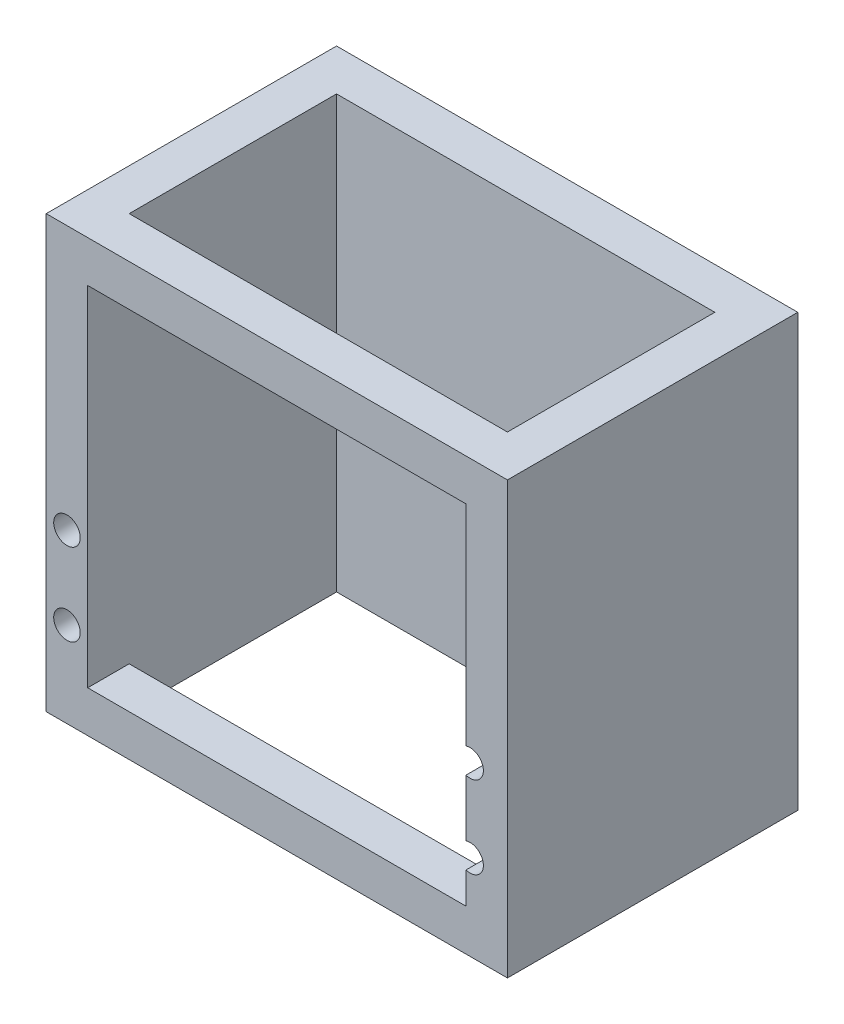
ISO-10303-21;
HEADER;
FILE_DESCRIPTION(('STEP AP214'),'2;1');
FILE_NAME('part.step','',(''),(''),'','','');
FILE_SCHEMA(('AUTOMOTIVE_DESIGN { 1 0 10303 214 1 1 1 1 }'));
ENDSEC;
DATA;
#1=APPLICATION_CONTEXT('core data for automotive mechanical design processes');
#2=APPLICATION_PROTOCOL_DEFINITION('international standard','automotive_design',2000,#1);
#3=PRODUCT_CONTEXT('',#1,'mechanical');
#4=PRODUCT('Part','Part','',(#3));
#5=PRODUCT_RELATED_PRODUCT_CATEGORY('part','',(#4));
#6=PRODUCT_DEFINITION_FORMATION('','',#4);
#7=PRODUCT_DEFINITION_CONTEXT('part definition',#1,'design');
#8=PRODUCT_DEFINITION('design','',#6,#7);
#9=PRODUCT_DEFINITION_SHAPE('','',#8);
#10=(LENGTH_UNIT() NAMED_UNIT(*) SI_UNIT(.MILLI.,.METRE.));
#11=(NAMED_UNIT(*) PLANE_ANGLE_UNIT() SI_UNIT($,.RADIAN.));
#12=(NAMED_UNIT(*) SI_UNIT($,.STERADIAN.) SOLID_ANGLE_UNIT());
#13=UNCERTAINTY_MEASURE_WITH_UNIT(LENGTH_MEASURE(1.E-05),#10,'distance_accuracy_value','');
#14=(GEOMETRIC_REPRESENTATION_CONTEXT(3) GLOBAL_UNCERTAINTY_ASSIGNED_CONTEXT((#13)) GLOBAL_UNIT_ASSIGNED_CONTEXT((#10,
#11,#12)) REPRESENTATION_CONTEXT('',''));
#15=CARTESIAN_POINT('',(0.,0.,0.));
#16=DIRECTION('',(0.,0.,1.));
#17=DIRECTION('',(1.,0.,0.));
#18=AXIS2_PLACEMENT_3D('',#15,#16,#17);
#19=CARTESIAN_POINT('',(5.,52.,30.));
#20=DIRECTION('',(0.,0.,-1.));
#21=DIRECTION('',(-1.,0.,0.));
#22=AXIS2_PLACEMENT_3D('',#19,#20,#21);
#23=PLANE('',#22);
#24=DIRECTION('',(-1.,0.,0.));
#25=VECTOR('',#24,1.);
#26=CARTESIAN_POINT('',(5.,47.,30.));
#27=LINE('',#26,#25);
#28=CARTESIAN_POINT('',(50.6,47.,30.));
#29=VERTEX_POINT('',#28);
#30=CARTESIAN_POINT('',(5.,47.,30.));
#31=VERTEX_POINT('',#30);
#32=EDGE_CURVE('E182',#29,#31,#27,.T.);
#33=ORIENTED_EDGE('',*,*,#32,.T.);
#34=DIRECTION('',(0.,-1.,0.));
#35=VECTOR('',#34,1.);
#36=CARTESIAN_POINT('',(5.,52.,30.));
#37=LINE('',#36,#35);
#38=CARTESIAN_POINT('',(5.,52.,30.));
#39=VERTEX_POINT('',#38);
#40=EDGE_CURVE('E225',#39,#31,#37,.T.);
#41=ORIENTED_EDGE('',*,*,#40,.F.);
#42=DIRECTION('',(1.,0.,0.));
#43=VECTOR('',#42,1.);
#44=CARTESIAN_POINT('',(5.,52.,30.));
#45=LINE('',#44,#43);
#46=CARTESIAN_POINT('',(50.6,52.,30.));
#47=VERTEX_POINT('',#46);
#48=EDGE_CURVE('E197',#39,#47,#45,.T.);
#49=ORIENTED_EDGE('',*,*,#48,.T.);
#50=DIRECTION('',(0.,-1.,0.));
#51=VECTOR('',#50,1.);
#52=CARTESIAN_POINT('',(50.6,52.,30.));
#53=LINE('',#52,#51);
#54=EDGE_CURVE('E221',#47,#29,#53,.T.);
#55=ORIENTED_EDGE('',*,*,#54,.T.);
#56=EDGE_LOOP('',(#33,#41,#49,#55));
#57=FACE_BOUND('',#56,.T.);
#58=ADVANCED_FACE('F33',(#57),#23,.T.);
#59=CARTESIAN_POINT('',(0.,52.,0.));
#60=DIRECTION('',(0.,1.,0.));
#61=DIRECTION('',(0.,0.,1.));
#62=AXIS2_PLACEMENT_3D('',#59,#60,#61);
#63=PLANE('',#62);
#64=DIRECTION('',(0.,0.,1.));
#65=VECTOR('',#64,1.);
#66=CARTESIAN_POINT('',(0.,52.,0.));
#67=LINE('',#66,#65);
#68=CARTESIAN_POINT('',(0.,52.,0.));
#69=VERTEX_POINT('',#68);
#70=CARTESIAN_POINT('',(0.,52.,35.));
#71=VERTEX_POINT('',#70);
#72=EDGE_CURVE('E229',#69,#71,#67,.T.);
#73=ORIENTED_EDGE('',*,*,#72,.T.);
#74=DIRECTION('',(1.,0.,0.));
#75=VECTOR('',#74,1.);
#76=CARTESIAN_POINT('',(0.,52.,35.));
#77=LINE('',#76,#75);
#78=CARTESIAN_POINT('',(55.6,52.,35.));
#79=VERTEX_POINT('',#78);
#80=EDGE_CURVE('E232',#71,#79,#77,.T.);
#81=ORIENTED_EDGE('',*,*,#80,.T.);
#82=DIRECTION('',(0.,0.,-1.));
#83=VECTOR('',#82,1.);
#84=CARTESIAN_POINT('',(55.6,52.,0.));
#85=LINE('',#84,#83);
#86=CARTESIAN_POINT('',(55.6,52.,0.));
#87=VERTEX_POINT('',#86);
#88=EDGE_CURVE('E235',#79,#87,#85,.T.);
#89=ORIENTED_EDGE('',*,*,#88,.T.);
#90=DIRECTION('',(-1.,0.,0.));
#91=VECTOR('',#90,1.);
#92=CARTESIAN_POINT('',(0.,52.,0.));
#93=LINE('',#92,#91);
#94=EDGE_CURVE('E237',#87,#69,#93,.T.);
#95=ORIENTED_EDGE('',*,*,#94,.T.);
#96=EDGE_LOOP('',(#73,#81,#89,#95));
#97=FACE_BOUND('',#96,.T.);
#98=ORIENTED_EDGE('',*,*,#48,.F.);
#99=DIRECTION('',(0.,0.,1.));
#100=VECTOR('',#99,1.);
#101=CARTESIAN_POINT('',(5.,52.,5.));
#102=LINE('',#101,#100);
#103=CARTESIAN_POINT('',(5.,52.,5.));
#104=VERTEX_POINT('',#103);
#105=EDGE_CURVE('E195',#104,#39,#102,.T.);
#106=ORIENTED_EDGE('',*,*,#105,.F.);
#107=DIRECTION('',(-1.,0.,0.));
#108=VECTOR('',#107,1.);
#109=CARTESIAN_POINT('',(5.,52.,5.));
#110=LINE('',#109,#108);
#111=CARTESIAN_POINT('',(50.6,52.,5.));
#112=VERTEX_POINT('',#111);
#113=EDGE_CURVE('E203',#112,#104,#110,.T.);
#114=ORIENTED_EDGE('',*,*,#113,.F.);
#115=DIRECTION('',(0.,0.,-1.));
#116=VECTOR('',#115,1.);
#117=CARTESIAN_POINT('',(50.6,52.,5.));
#118=LINE('',#117,#116);
#119=EDGE_CURVE('E200',#47,#112,#118,.T.);
#120=ORIENTED_EDGE('',*,*,#119,.F.);
#121=EDGE_LOOP('',(#98,#106,#114,#120));
#122=FACE_BOUND('',#121,.T.);
#123=ADVANCED_FACE('F282',(#97,#122),#63,.T.);
#124=CARTESIAN_POINT('',(0.,0.,0.));
#125=DIRECTION('',(0.,1.,0.));
#126=DIRECTION('',(0.,0.,1.));
#127=AXIS2_PLACEMENT_3D('',#124,#125,#126);
#128=PLANE('',#127);
#129=DIRECTION('',(0.,0.,1.));
#130=VECTOR('',#129,1.);
#131=CARTESIAN_POINT('',(0.,0.,0.));
#132=LINE('',#131,#130);
#133=CARTESIAN_POINT('',(0.,0.,0.));
#134=VERTEX_POINT('',#133);
#135=CARTESIAN_POINT('',(0.,0.,35.));
#136=VERTEX_POINT('',#135);
#137=EDGE_CURVE('E228',#134,#136,#132,.T.);
#138=ORIENTED_EDGE('',*,*,#137,.F.);
#139=DIRECTION('',(-1.,0.,0.));
#140=VECTOR('',#139,1.);
#141=CARTESIAN_POINT('',(0.,0.,0.));
#142=LINE('',#141,#140);
#143=CARTESIAN_POINT('',(55.6,0.,0.));
#144=VERTEX_POINT('',#143);
#145=EDGE_CURVE('E233',#144,#134,#142,.T.);
#146=ORIENTED_EDGE('',*,*,#145,.F.);
#147=DIRECTION('',(0.,0.,-1.));
#148=VECTOR('',#147,1.);
#149=CARTESIAN_POINT('',(55.6,0.,0.));
#150=LINE('',#149,#148);
#151=CARTESIAN_POINT('',(55.6,0.,35.));
#152=VERTEX_POINT('',#151);
#153=EDGE_CURVE('E244',#152,#144,#150,.T.);
#154=ORIENTED_EDGE('',*,*,#153,.F.);
#155=DIRECTION('',(1.,0.,0.));
#156=VECTOR('',#155,1.);
#157=CARTESIAN_POINT('',(0.,0.,35.));
#158=LINE('',#157,#156);
#159=EDGE_CURVE('E242',#136,#152,#158,.T.);
#160=ORIENTED_EDGE('',*,*,#159,.F.);
#161=EDGE_LOOP('',(#138,#146,#154,#160));
#162=FACE_BOUND('',#161,.T.);
#163=DIRECTION('',(0.,0.,1.));
#164=VECTOR('',#163,1.);
#165=CARTESIAN_POINT('',(5.,0.,5.));
#166=LINE('',#165,#164);
#167=CARTESIAN_POINT('',(5.,0.,5.));
#168=VERTEX_POINT('',#167);
#169=CARTESIAN_POINT('',(5.,0.,30.));
#170=VERTEX_POINT('',#169);
#171=EDGE_CURVE('E187',#168,#170,#166,.T.);
#172=ORIENTED_EDGE('',*,*,#171,.T.);
#173=DIRECTION('',(1.,0.,0.));
#174=VECTOR('',#173,1.);
#175=CARTESIAN_POINT('',(5.,0.,30.));
#176=LINE('',#175,#174);
#177=CARTESIAN_POINT('',(50.6,0.,30.));
#178=VERTEX_POINT('',#177);
#179=EDGE_CURVE('E208',#170,#178,#176,.T.);
#180=ORIENTED_EDGE('',*,*,#179,.T.);
#181=DIRECTION('',(0.,0.,-1.));
#182=VECTOR('',#181,1.);
#183=CARTESIAN_POINT('',(50.6,0.,5.));
#184=LINE('',#183,#182);
#185=CARTESIAN_POINT('',(50.6,0.,5.));
#186=VERTEX_POINT('',#185);
#187=EDGE_CURVE('E211',#178,#186,#184,.T.);
#188=ORIENTED_EDGE('',*,*,#187,.T.);
#189=DIRECTION('',(-1.,0.,0.));
#190=VECTOR('',#189,1.);
#191=CARTESIAN_POINT('',(5.,0.,5.));
#192=LINE('',#191,#190);
#193=EDGE_CURVE('E198',#186,#168,#192,.T.);
#194=ORIENTED_EDGE('',*,*,#193,.T.);
#195=EDGE_LOOP('',(#172,#180,#188,#194));
#196=FACE_BOUND('',#195,.T.);
#197=ADVANCED_FACE('F289',(#162,#196),#128,.F.);
#198=CARTESIAN_POINT('',(0.,52.,0.));
#199=DIRECTION('',(1.,0.,0.));
#200=DIRECTION('',(0.,0.,-1.));
#201=AXIS2_PLACEMENT_3D('',#198,#199,#200);
#202=PLANE('',#201);
#203=ORIENTED_EDGE('',*,*,#137,.T.);
#204=DIRECTION('',(0.,-1.,0.));
#205=VECTOR('',#204,1.);
#206=CARTESIAN_POINT('',(0.,52.,35.));
#207=LINE('',#206,#205);
#208=EDGE_CURVE('E255',#71,#136,#207,.T.);
#209=ORIENTED_EDGE('',*,*,#208,.F.);
#210=ORIENTED_EDGE('',*,*,#72,.F.);
#211=DIRECTION('',(0.,-1.,0.));
#212=VECTOR('',#211,1.);
#213=CARTESIAN_POINT('',(0.,52.,0.));
#214=LINE('',#213,#212);
#215=EDGE_CURVE('E239',#69,#134,#214,.T.);
#216=ORIENTED_EDGE('',*,*,#215,.T.);
#217=EDGE_LOOP('',(#203,#209,#210,#216));
#218=FACE_BOUND('',#217,.T.);
#219=ADVANCED_FACE('F35',(#218),#202,.F.);
#220=CARTESIAN_POINT('',(0.,52.,35.));
#221=DIRECTION('',(0.,0.,-1.));
#222=DIRECTION('',(-1.,0.,0.));
#223=AXIS2_PLACEMENT_3D('',#220,#221,#222);
#224=PLANE('',#223);
#225=CARTESIAN_POINT('',(2.5,20.2,35.));
#226=DIRECTION('',(0.,0.,1.));
#227=DIRECTION('',(1.,0.,0.));
#228=AXIS2_PLACEMENT_3D('',#225,#226,#227);
#229=CIRCLE('',#228,1.6);
#230=CARTESIAN_POINT('',(4.1,20.2,35.));
#231=VERTEX_POINT('',#230);
#232=EDGE_CURVE('E340',#231,#231,#229,.T.);
#233=ORIENTED_EDGE('',*,*,#232,.F.);
#234=EDGE_LOOP('',(#233));
#235=FACE_BOUND('',#234,.T.);
#236=CARTESIAN_POINT('',(2.5,10.3,35.));
#237=DIRECTION('',(0.,0.,1.));
#238=DIRECTION('',(1.,0.,0.));
#239=AXIS2_PLACEMENT_3D('',#236,#237,#238);
#240=CIRCLE('',#239,1.6);
#241=CARTESIAN_POINT('',(4.1,10.3,35.));
#242=VERTEX_POINT('',#241);
#243=EDGE_CURVE('E335',#242,#242,#240,.T.);
#244=ORIENTED_EDGE('',*,*,#243,.F.);
#245=EDGE_LOOP('',(#244));
#246=FACE_BOUND('',#245,.T.);
#247=DIRECTION('',(0.,1.,0.));
#248=VECTOR('',#247,1.);
#249=CARTESIAN_POINT('',(50.6,47.,35.));
#250=LINE('',#249,#248);
#251=CARTESIAN_POINT('',(50.6,11.8198684153571,35.));
#252=VERTEX_POINT('',#251);
#253=CARTESIAN_POINT('',(50.6,18.6801315846429,35.));
#254=VERTEX_POINT('',#253);
#255=EDGE_CURVE('E170',#252,#254,#250,.T.);
#256=ORIENTED_EDGE('',*,*,#255,.F.);
#257=CARTESIAN_POINT('',(51.1,10.3,35.));
#258=DIRECTION('',(0.,0.,1.));
#259=DIRECTION('',(1.,0.,0.));
#260=AXIS2_PLACEMENT_3D('',#257,#258,#259);
#261=CIRCLE('',#260,1.6);
#262=CARTESIAN_POINT('',(50.6,8.78013158464293,35.));
#263=VERTEX_POINT('',#262);
#264=EDGE_CURVE('E266',#263,#252,#261,.T.);
#265=ORIENTED_EDGE('',*,*,#264,.F.);
#266=CARTESIAN_POINT('',(50.6,5.,35.));
#267=VERTEX_POINT('',#266);
#268=EDGE_CURVE('E173',#267,#263,#250,.T.);
#269=ORIENTED_EDGE('',*,*,#268,.F.);
#270=DIRECTION('',(1.,0.,0.));
#271=VECTOR('',#270,1.);
#272=CARTESIAN_POINT('',(5.00000000000001,5.,35.));
#273=LINE('',#272,#271);
#274=CARTESIAN_POINT('',(5.00000000000001,5.,35.));
#275=VERTEX_POINT('',#274);
#276=EDGE_CURVE('E171',#275,#267,#273,.T.);
#277=ORIENTED_EDGE('',*,*,#276,.F.);
#278=DIRECTION('',(0.,-1.,0.));
#279=VECTOR('',#278,1.);
#280=CARTESIAN_POINT('',(5.,47.,35.));
#281=LINE('',#280,#279);
#282=CARTESIAN_POINT('',(5.,47.,35.));
#283=VERTEX_POINT('',#282);
#284=EDGE_CURVE('E174',#283,#275,#281,.T.);
#285=ORIENTED_EDGE('',*,*,#284,.F.);
#286=DIRECTION('',(-1.,0.,0.));
#287=VECTOR('',#286,1.);
#288=CARTESIAN_POINT('',(5.,47.,35.));
#289=LINE('',#288,#287);
#290=CARTESIAN_POINT('',(50.6,47.,35.));
#291=VERTEX_POINT('',#290);
#292=EDGE_CURVE('E169',#291,#283,#289,.T.);
#293=ORIENTED_EDGE('',*,*,#292,.F.);
#294=CARTESIAN_POINT('',(50.6,21.7198684153571,35.));
#295=VERTEX_POINT('',#294);
#296=EDGE_CURVE('E160',#295,#291,#250,.T.);
#297=ORIENTED_EDGE('',*,*,#296,.F.);
#298=CARTESIAN_POINT('',(51.1,20.2,35.));
#299=DIRECTION('',(0.,0.,1.));
#300=DIRECTION('',(1.,0.,0.));
#301=AXIS2_PLACEMENT_3D('',#298,#299,#300);
#302=CIRCLE('',#301,1.6);
#303=EDGE_CURVE('E144',#254,#295,#302,.T.);
#304=ORIENTED_EDGE('',*,*,#303,.F.);
#305=EDGE_LOOP('',(#256,#265,#269,#277,#285,#293,#297,#304));
#306=FACE_BOUND('',#305,.T.);
#307=ORIENTED_EDGE('',*,*,#159,.T.);
#308=DIRECTION('',(0.,-1.,0.));
#309=VECTOR('',#308,1.);
#310=CARTESIAN_POINT('',(55.6,52.,35.));
#311=LINE('',#310,#309);
#312=EDGE_CURVE('E252',#79,#152,#311,.T.);
#313=ORIENTED_EDGE('',*,*,#312,.F.);
#314=ORIENTED_EDGE('',*,*,#80,.F.);
#315=ORIENTED_EDGE('',*,*,#208,.T.);
#316=EDGE_LOOP('',(#307,#313,#314,#315));
#317=FACE_BOUND('',#316,.T.);
#318=ADVANCED_FACE('F165',(#235,#246,#306,#317),#224,.F.);
#319=CARTESIAN_POINT('',(55.6,52.,0.));
#320=DIRECTION('',(-1.,0.,0.));
#321=DIRECTION('',(0.,0.,1.));
#322=AXIS2_PLACEMENT_3D('',#319,#320,#321);
#323=PLANE('',#322);
#324=ORIENTED_EDGE('',*,*,#153,.T.);
#325=DIRECTION('',(0.,-1.,0.));
#326=VECTOR('',#325,1.);
#327=CARTESIAN_POINT('',(55.6,52.,0.));
#328=LINE('',#327,#326);
#329=EDGE_CURVE('E249',#87,#144,#328,.T.);
#330=ORIENTED_EDGE('',*,*,#329,.F.);
#331=ORIENTED_EDGE('',*,*,#88,.F.);
#332=ORIENTED_EDGE('',*,*,#312,.T.);
#333=EDGE_LOOP('',(#324,#330,#331,#332));
#334=FACE_BOUND('',#333,.T.);
#335=ADVANCED_FACE('F348',(#334),#323,.F.);
#336=CARTESIAN_POINT('',(0.,52.,0.));
#337=DIRECTION('',(0.,0.,1.));
#338=DIRECTION('',(1.,0.,0.));
#339=AXIS2_PLACEMENT_3D('',#336,#337,#338);
#340=PLANE('',#339);
#341=ORIENTED_EDGE('',*,*,#145,.T.);
#342=ORIENTED_EDGE('',*,*,#215,.F.);
#343=ORIENTED_EDGE('',*,*,#94,.F.);
#344=ORIENTED_EDGE('',*,*,#329,.T.);
#345=EDGE_LOOP('',(#341,#342,#343,#344));
#346=FACE_BOUND('',#345,.T.);
#347=ADVANCED_FACE('F303',(#346),#340,.F.);
#348=CARTESIAN_POINT('',(5.,52.,5.));
#349=DIRECTION('',(1.,0.,0.));
#350=DIRECTION('',(0.,0.,-1.));
#351=AXIS2_PLACEMENT_3D('',#348,#349,#350);
#352=PLANE('',#351);
#353=ORIENTED_EDGE('',*,*,#171,.F.);
#354=DIRECTION('',(0.,-1.,0.));
#355=VECTOR('',#354,1.);
#356=CARTESIAN_POINT('',(5.,52.,5.));
#357=LINE('',#356,#355);
#358=EDGE_CURVE('E205',#104,#168,#357,.T.);
#359=ORIENTED_EDGE('',*,*,#358,.F.);
#360=ORIENTED_EDGE('',*,*,#105,.T.);
#361=ORIENTED_EDGE('',*,*,#40,.T.);
#362=DIRECTION('',(0.,0.,1.));
#363=VECTOR('',#362,1.);
#364=CARTESIAN_POINT('',(5.,47.,30.));
#365=LINE('',#364,#363);
#366=EDGE_CURVE('E185',#31,#283,#365,.T.);
#367=ORIENTED_EDGE('',*,*,#366,.T.);
#368=ORIENTED_EDGE('',*,*,#284,.T.);
#369=DIRECTION('',(0.,0.,1.));
#370=VECTOR('',#369,1.);
#371=CARTESIAN_POINT('',(5.00000000000001,5.,30.));
#372=LINE('',#371,#370);
#373=CARTESIAN_POINT('',(5.00000000000001,5.,30.));
#374=VERTEX_POINT('',#373);
#375=EDGE_CURVE('E192',#374,#275,#372,.T.);
#376=ORIENTED_EDGE('',*,*,#375,.F.);
#377=EDGE_CURVE('E224',#374,#170,#37,.T.);
#378=ORIENTED_EDGE('',*,*,#377,.T.);
#379=EDGE_LOOP('',(#353,#359,#360,#361,#367,#368,#376,#378));
#380=FACE_BOUND('',#379,.T.);
#381=ADVANCED_FACE('F296',(#380),#352,.T.);
#382=DIRECTION('',(1.,0.,0.));
#383=VECTOR('',#382,1.);
#384=CARTESIAN_POINT('',(5.00000000000001,5.,30.));
#385=LINE('',#384,#383);
#386=CARTESIAN_POINT('',(50.6,5.,30.));
#387=VERTEX_POINT('',#386);
#388=EDGE_CURVE('E180',#374,#387,#385,.T.);
#389=ORIENTED_EDGE('',*,*,#388,.T.);
#390=EDGE_CURVE('E220',#387,#178,#53,.T.);
#391=ORIENTED_EDGE('',*,*,#390,.T.);
#392=ORIENTED_EDGE('',*,*,#179,.F.);
#393=ORIENTED_EDGE('',*,*,#377,.F.);
#394=EDGE_LOOP('',(#389,#391,#392,#393));
#395=FACE_BOUND('',#394,.T.);
#396=ADVANCED_FACE('F285',(#395),#23,.T.);
#397=CARTESIAN_POINT('',(50.6,52.,5.));
#398=DIRECTION('',(-1.,0.,0.));
#399=DIRECTION('',(0.,0.,1.));
#400=AXIS2_PLACEMENT_3D('',#397,#398,#399);
#401=PLANE('',#400);
#402=DIRECTION('',(0.,0.,1.));
#403=VECTOR('',#402,1.);
#404=CARTESIAN_POINT('',(50.6,8.78013158464293,30.));
#405=LINE('',#404,#403);
#406=CARTESIAN_POINT('',(50.6,8.78013158464293,30.));
#407=VERTEX_POINT('',#406);
#408=EDGE_CURVE('E11',#407,#263,#405,.T.);
#409=ORIENTED_EDGE('',*,*,#408,.F.);
#410=DIRECTION('',(0.,1.,0.));
#411=VECTOR('',#410,1.);
#412=CARTESIAN_POINT('',(50.6,52.,30.));
#413=LINE('',#412,#411);
#414=CARTESIAN_POINT('',(50.6,11.8198684153571,30.));
#415=VERTEX_POINT('',#414);
#416=EDGE_CURVE('E260',#407,#415,#413,.T.);
#417=ORIENTED_EDGE('',*,*,#416,.T.);
#418=DIRECTION('',(0.,0.,1.));
#419=VECTOR('',#418,1.);
#420=CARTESIAN_POINT('',(50.6,11.8198684153571,30.));
#421=LINE('',#420,#419);
#422=EDGE_CURVE('E41',#252,#415,#421,.F.);
#423=ORIENTED_EDGE('',*,*,#422,.F.);
#424=ORIENTED_EDGE('',*,*,#255,.T.);
#425=DIRECTION('',(0.,0.,1.));
#426=VECTOR('',#425,1.);
#427=CARTESIAN_POINT('',(50.6,18.6801315846429,30.));
#428=LINE('',#427,#426);
#429=CARTESIAN_POINT('',(50.6,18.6801315846429,30.));
#430=VERTEX_POINT('',#429);
#431=EDGE_CURVE('E150',#430,#254,#428,.T.);
#432=ORIENTED_EDGE('',*,*,#431,.F.);
#433=DIRECTION('',(0.,1.,0.));
#434=VECTOR('',#433,1.);
#435=CARTESIAN_POINT('',(50.6,52.,30.));
#436=LINE('',#435,#434);
#437=CARTESIAN_POINT('',(50.6,21.7198684153571,30.));
#438=VERTEX_POINT('',#437);
#439=EDGE_CURVE('E162',#430,#438,#436,.T.);
#440=ORIENTED_EDGE('',*,*,#439,.T.);
#441=DIRECTION('',(0.,0.,1.));
#442=VECTOR('',#441,1.);
#443=CARTESIAN_POINT('',(50.6,21.7198684153571,30.));
#444=LINE('',#443,#442);
#445=EDGE_CURVE('E147',#295,#438,#444,.F.);
#446=ORIENTED_EDGE('',*,*,#445,.F.);
#447=ORIENTED_EDGE('',*,*,#296,.T.);
#448=DIRECTION('',(0.,0.,1.));
#449=VECTOR('',#448,1.);
#450=CARTESIAN_POINT('',(50.6,47.,30.));
#451=LINE('',#450,#449);
#452=EDGE_CURVE('E188',#29,#291,#451,.T.);
#453=ORIENTED_EDGE('',*,*,#452,.F.);
#454=ORIENTED_EDGE('',*,*,#54,.F.);
#455=ORIENTED_EDGE('',*,*,#119,.T.);
#456=DIRECTION('',(0.,-1.,0.));
#457=VECTOR('',#456,1.);
#458=CARTESIAN_POINT('',(50.6,52.,5.));
#459=LINE('',#458,#457);
#460=EDGE_CURVE('E218',#112,#186,#459,.T.);
#461=ORIENTED_EDGE('',*,*,#460,.T.);
#462=ORIENTED_EDGE('',*,*,#187,.F.);
#463=ORIENTED_EDGE('',*,*,#390,.F.);
#464=DIRECTION('',(0.,0.,1.));
#465=VECTOR('',#464,1.);
#466=CARTESIAN_POINT('',(50.6,5.,30.));
#467=LINE('',#466,#465);
#468=EDGE_CURVE('E190',#387,#267,#467,.T.);
#469=ORIENTED_EDGE('',*,*,#468,.T.);
#470=ORIENTED_EDGE('',*,*,#268,.T.);
#471=EDGE_LOOP('',(#409,#417,#423,#424,#432,#440,#446,#447,#453,#454,#455,#461,#462,#463,#469,#470));
#472=FACE_BOUND('',#471,.T.);
#473=ADVANCED_FACE('F158',(#472),#401,.T.);
#474=CARTESIAN_POINT('',(5.,52.,5.));
#475=DIRECTION('',(0.,0.,1.));
#476=DIRECTION('',(1.,0.,0.));
#477=AXIS2_PLACEMENT_3D('',#474,#475,#476);
#478=PLANE('',#477);
#479=ORIENTED_EDGE('',*,*,#193,.F.);
#480=ORIENTED_EDGE('',*,*,#460,.F.);
#481=ORIENTED_EDGE('',*,*,#113,.T.);
#482=ORIENTED_EDGE('',*,*,#358,.T.);
#483=EDGE_LOOP('',(#479,#480,#481,#482));
#484=FACE_BOUND('',#483,.T.);
#485=ADVANCED_FACE('F302',(#484),#478,.T.);
#486=CARTESIAN_POINT('',(5.,47.,30.));
#487=DIRECTION('',(0.,1.,0.));
#488=DIRECTION('',(0.,0.,1.));
#489=AXIS2_PLACEMENT_3D('',#486,#487,#488);
#490=PLANE('',#489);
#491=ORIENTED_EDGE('',*,*,#292,.T.);
#492=ORIENTED_EDGE('',*,*,#366,.F.);
#493=ORIENTED_EDGE('',*,*,#32,.F.);
#494=ORIENTED_EDGE('',*,*,#452,.T.);
#495=EDGE_LOOP('',(#491,#492,#493,#494));
#496=FACE_BOUND('',#495,.T.);
#497=ADVANCED_FACE('F404',(#496),#490,.F.);
#498=CARTESIAN_POINT('',(5.00000000000001,5.,30.));
#499=DIRECTION('',(0.,-1.,0.));
#500=DIRECTION('',(0.,0.,-1.));
#501=AXIS2_PLACEMENT_3D('',#498,#499,#500);
#502=PLANE('',#501);
#503=ORIENTED_EDGE('',*,*,#468,.F.);
#504=ORIENTED_EDGE('',*,*,#388,.F.);
#505=ORIENTED_EDGE('',*,*,#375,.T.);
#506=ORIENTED_EDGE('',*,*,#276,.T.);
#507=EDGE_LOOP('',(#503,#504,#505,#506));
#508=FACE_BOUND('',#507,.T.);
#509=ADVANCED_FACE('F312',(#508),#502,.F.);
#510=CARTESIAN_POINT('',(51.1,20.2,30.));
#511=DIRECTION('',(0.,0.,1.));
#512=DIRECTION('',(1.,0.,0.));
#513=AXIS2_PLACEMENT_3D('',#510,#511,#512);
#514=CYLINDRICAL_SURFACE('',#513,1.6);
#515=ORIENTED_EDGE('',*,*,#431,.T.);
#516=ORIENTED_EDGE('',*,*,#303,.T.);
#517=ORIENTED_EDGE('',*,*,#445,.T.);
#518=CARTESIAN_POINT('',(51.1,20.2,30.));
#519=DIRECTION('',(0.,0.,1.));
#520=DIRECTION('',(1.,0.,0.));
#521=AXIS2_PLACEMENT_3D('',#518,#519,#520);
#522=CIRCLE('',#521,1.6);
#523=EDGE_CURVE('E54',#430,#438,#522,.T.);
#524=ORIENTED_EDGE('',*,*,#523,.F.);
#525=EDGE_LOOP('',(#515,#516,#517,#524));
#526=FACE_BOUND('',#525,.T.);
#527=ADVANCED_FACE('F146',(#526),#514,.F.);
#528=CARTESIAN_POINT('',(51.1,20.2,30.));
#529=DIRECTION('',(0.,0.,1.));
#530=DIRECTION('',(1.,0.,0.));
#531=AXIS2_PLACEMENT_3D('',#528,#529,#530);
#532=PLANE('',#531);
#533=ORIENTED_EDGE('',*,*,#523,.T.);
#534=ORIENTED_EDGE('',*,*,#439,.F.);
#535=EDGE_LOOP('',(#533,#534));
#536=FACE_BOUND('',#535,.T.);
#537=ADVANCED_FACE('F278',(#536),#532,.T.);
#538=CARTESIAN_POINT('',(51.1,10.3,30.));
#539=DIRECTION('',(0.,0.,1.));
#540=DIRECTION('',(1.,0.,0.));
#541=AXIS2_PLACEMENT_3D('',#538,#539,#540);
#542=CYLINDRICAL_SURFACE('',#541,1.6);
#543=ORIENTED_EDGE('',*,*,#408,.T.);
#544=ORIENTED_EDGE('',*,*,#264,.T.);
#545=ORIENTED_EDGE('',*,*,#422,.T.);
#546=CARTESIAN_POINT('',(51.1,10.3,30.));
#547=DIRECTION('',(0.,0.,1.));
#548=DIRECTION('',(1.,0.,0.));
#549=AXIS2_PLACEMENT_3D('',#546,#547,#548);
#550=CIRCLE('',#549,1.6);
#551=EDGE_CURVE('E47',#407,#415,#550,.T.);
#552=ORIENTED_EDGE('',*,*,#551,.F.);
#553=EDGE_LOOP('',(#543,#544,#545,#552));
#554=FACE_BOUND('',#553,.T.);
#555=ADVANCED_FACE('F264',(#554),#542,.F.);
#556=CARTESIAN_POINT('',(51.1,10.3,30.));
#557=DIRECTION('',(0.,0.,1.));
#558=DIRECTION('',(1.,0.,0.));
#559=AXIS2_PLACEMENT_3D('',#556,#557,#558);
#560=PLANE('',#559);
#561=ORIENTED_EDGE('',*,*,#551,.T.);
#562=ORIENTED_EDGE('',*,*,#416,.F.);
#563=EDGE_LOOP('',(#561,#562));
#564=FACE_BOUND('',#563,.T.);
#565=ADVANCED_FACE('F267',(#564),#560,.T.);
#566=CARTESIAN_POINT('',(2.5,10.3,30.));
#567=DIRECTION('',(0.,0.,1.));
#568=DIRECTION('',(1.,0.,0.));
#569=AXIS2_PLACEMENT_3D('',#566,#567,#568);
#570=CYLINDRICAL_SURFACE('',#569,1.6);
#571=CARTESIAN_POINT('',(2.5,10.3,30.));
#572=DIRECTION('',(0.,0.,1.));
#573=DIRECTION('',(1.,0.,0.));
#574=AXIS2_PLACEMENT_3D('',#571,#572,#573);
#575=CIRCLE('',#574,1.6);
#576=CARTESIAN_POINT('',(4.1,10.3,30.));
#577=VERTEX_POINT('',#576);
#578=EDGE_CURVE('E332',#577,#577,#575,.T.);
#579=ORIENTED_EDGE('',*,*,#578,.F.);
#580=EDGE_LOOP('',(#579));
#581=FACE_BOUND('',#580,.T.);
#582=ORIENTED_EDGE('',*,*,#243,.T.);
#583=EDGE_LOOP('',(#582));
#584=FACE_BOUND('',#583,.T.);
#585=ADVANCED_FACE('F269',(#581,#584),#570,.F.);
#586=CARTESIAN_POINT('',(2.5,10.3,30.));
#587=DIRECTION('',(0.,0.,1.));
#588=DIRECTION('',(1.,0.,0.));
#589=AXIS2_PLACEMENT_3D('',#586,#587,#588);
#590=PLANE('',#589);
#591=ORIENTED_EDGE('',*,*,#578,.T.);
#592=EDGE_LOOP('',(#591));
#593=FACE_BOUND('',#592,.T.);
#594=ADVANCED_FACE('F275',(#593),#590,.T.);
#595=CARTESIAN_POINT('',(2.5,20.2,30.));
#596=DIRECTION('',(0.,0.,1.));
#597=DIRECTION('',(1.,0.,0.));
#598=AXIS2_PLACEMENT_3D('',#595,#596,#597);
#599=CYLINDRICAL_SURFACE('',#598,1.6);
#600=CARTESIAN_POINT('',(2.5,20.2,30.));
#601=DIRECTION('',(0.,0.,1.));
#602=DIRECTION('',(1.,0.,0.));
#603=AXIS2_PLACEMENT_3D('',#600,#601,#602);
#604=CIRCLE('',#603,1.6);
#605=CARTESIAN_POINT('',(4.1,20.2,30.));
#606=VERTEX_POINT('',#605);
#607=EDGE_CURVE('E338',#606,#606,#604,.T.);
#608=ORIENTED_EDGE('',*,*,#607,.F.);
#609=EDGE_LOOP('',(#608));
#610=FACE_BOUND('',#609,.T.);
#611=ORIENTED_EDGE('',*,*,#232,.T.);
#612=EDGE_LOOP('',(#611));
#613=FACE_BOUND('',#612,.T.);
#614=ADVANCED_FACE('F344',(#610,#613),#599,.F.);
#615=CARTESIAN_POINT('',(2.5,20.2,30.));
#616=DIRECTION('',(0.,0.,1.));
#617=DIRECTION('',(1.,0.,0.));
#618=AXIS2_PLACEMENT_3D('',#615,#616,#617);
#619=PLANE('',#618);
#620=ORIENTED_EDGE('',*,*,#607,.T.);
#621=EDGE_LOOP('',(#620));
#622=FACE_BOUND('',#621,.T.);
#623=ADVANCED_FACE('F494',(#622),#619,.T.);
#624=CLOSED_SHELL('',(#58,#123,#197,#219,#318,#335,#347,#381,#396,#473,#485,#497,#509,#527,#537,
#555,#565,#585,#594,#614,#623));
#625=MANIFOLD_SOLID_BREP('B2',#624);
#626=ADVANCED_BREP_SHAPE_REPRESENTATION('',(#18,#625),#14);
#627=SHAPE_DEFINITION_REPRESENTATION(#9,#626);
ENDSEC;
END-ISO-10303-21;
